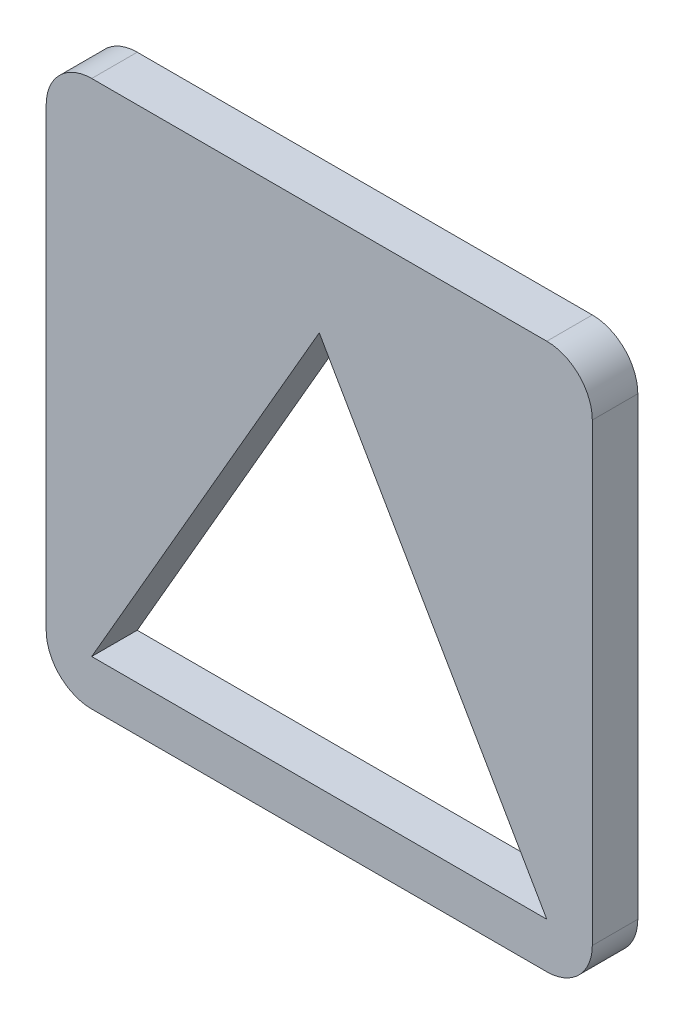
ISO-10303-21;
HEADER;
FILE_DESCRIPTION(('STEP AP214'),'2;1');
FILE_NAME('part.step','',(''),(''),'','','');
FILE_SCHEMA(('AUTOMOTIVE_DESIGN { 1 0 10303 214 1 1 1 1 }'));
ENDSEC;
DATA;
#1=APPLICATION_CONTEXT('core data for automotive mechanical design processes');
#2=APPLICATION_PROTOCOL_DEFINITION('international standard','automotive_design',2000,#1);
#3=PRODUCT_CONTEXT('',#1,'mechanical');
#4=PRODUCT('Part','Part','',(#3));
#5=PRODUCT_RELATED_PRODUCT_CATEGORY('part','',(#4));
#6=PRODUCT_DEFINITION_FORMATION('','',#4);
#7=PRODUCT_DEFINITION_CONTEXT('part definition',#1,'design');
#8=PRODUCT_DEFINITION('design','',#6,#7);
#9=PRODUCT_DEFINITION_SHAPE('','',#8);
#10=(LENGTH_UNIT() NAMED_UNIT(*) SI_UNIT(.MILLI.,.METRE.));
#11=(NAMED_UNIT(*) PLANE_ANGLE_UNIT() SI_UNIT($,.RADIAN.));
#12=(NAMED_UNIT(*) SI_UNIT($,.STERADIAN.) SOLID_ANGLE_UNIT());
#13=UNCERTAINTY_MEASURE_WITH_UNIT(LENGTH_MEASURE(1.E-05),#10,'distance_accuracy_value','');
#14=(GEOMETRIC_REPRESENTATION_CONTEXT(3) GLOBAL_UNCERTAINTY_ASSIGNED_CONTEXT((#13)) GLOBAL_UNIT_ASSIGNED_CONTEXT((#10,
#11,#12)) REPRESENTATION_CONTEXT('',''));
#15=CARTESIAN_POINT('',(0.,0.,0.));
#16=DIRECTION('',(0.,0.,1.));
#17=DIRECTION('',(1.,0.,0.));
#18=AXIS2_PLACEMENT_3D('',#15,#16,#17);
#19=CARTESIAN_POINT('',(-49.9999999999999,60.,10.));
#20=DIRECTION('',(0.,1.,0.));
#21=DIRECTION('',(0.,0.,1.));
#22=AXIS2_PLACEMENT_3D('',#19,#20,#21);
#23=PLANE('',#22);
#24=DIRECTION('',(1.,0.,0.));
#25=VECTOR('',#24,1.);
#26=CARTESIAN_POINT('',(-49.9999999999999,60.,0.));
#27=LINE('',#26,#25);
#28=CARTESIAN_POINT('',(-49.9999999999999,60.,0.));
#29=VERTEX_POINT('',#28);
#30=CARTESIAN_POINT('',(49.9999999999999,60.,0.));
#31=VERTEX_POINT('',#30);
#32=EDGE_CURVE('E142',#29,#31,#27,.T.);
#33=ORIENTED_EDGE('',*,*,#32,.F.);
#34=DIRECTION('',(0.,0.,-1.));
#35=VECTOR('',#34,1.);
#36=CARTESIAN_POINT('',(-49.9999999999999,60.,10.));
#37=LINE('',#36,#35);
#38=CARTESIAN_POINT('',(-49.9999999999999,60.,10.));
#39=VERTEX_POINT('',#38);
#40=EDGE_CURVE('E11',#39,#29,#37,.T.);
#41=ORIENTED_EDGE('',*,*,#40,.F.);
#42=DIRECTION('',(1.,0.,0.));
#43=VECTOR('',#42,1.);
#44=CARTESIAN_POINT('',(-49.9999999999999,60.,10.));
#45=LINE('',#44,#43);
#46=CARTESIAN_POINT('',(49.9999999999999,60.,10.));
#47=VERTEX_POINT('',#46);
#48=EDGE_CURVE('E144',#39,#47,#45,.T.);
#49=ORIENTED_EDGE('',*,*,#48,.T.);
#50=DIRECTION('',(0.,0.,-1.));
#51=VECTOR('',#50,1.);
#52=CARTESIAN_POINT('',(49.9999999999999,60.,10.));
#53=LINE('',#52,#51);
#54=EDGE_CURVE('E36',#47,#31,#53,.T.);
#55=ORIENTED_EDGE('',*,*,#54,.T.);
#56=EDGE_LOOP('',(#33,#41,#49,#55));
#57=FACE_BOUND('',#56,.T.);
#58=ADVANCED_FACE('F33',(#57),#23,.T.);
#59=CARTESIAN_POINT('',(-50.,50.,10.));
#60=DIRECTION('',(0.,0.,-1.));
#61=DIRECTION('',(-1.,0.,0.));
#62=AXIS2_PLACEMENT_3D('',#59,#60,#61);
#63=CYLINDRICAL_SURFACE('',#62,10.);
#64=CARTESIAN_POINT('',(-50.,50.,0.));
#65=DIRECTION('',(0.,0.,1.));
#66=DIRECTION('',(1.,0.,0.));
#67=AXIS2_PLACEMENT_3D('',#64,#65,#66);
#68=CIRCLE('',#67,10.);
#69=CARTESIAN_POINT('',(-60.,49.9999999999999,0.));
#70=VERTEX_POINT('',#69);
#71=EDGE_CURVE('E148',#29,#70,#68,.T.);
#72=ORIENTED_EDGE('',*,*,#71,.T.);
#73=DIRECTION('',(0.,0.,-1.));
#74=VECTOR('',#73,1.);
#75=CARTESIAN_POINT('',(-60.,49.9999999999999,10.));
#76=LINE('',#75,#74);
#77=CARTESIAN_POINT('',(-60.,49.9999999999999,10.));
#78=VERTEX_POINT('',#77);
#79=EDGE_CURVE('E41',#78,#70,#76,.T.);
#80=ORIENTED_EDGE('',*,*,#79,.F.);
#81=CARTESIAN_POINT('',(-50.,50.,10.));
#82=DIRECTION('',(0.,0.,1.));
#83=DIRECTION('',(1.,0.,0.));
#84=AXIS2_PLACEMENT_3D('',#81,#82,#83);
#85=CIRCLE('',#84,10.);
#86=EDGE_CURVE('E162',#39,#78,#85,.T.);
#87=ORIENTED_EDGE('',*,*,#86,.F.);
#88=ORIENTED_EDGE('',*,*,#40,.T.);
#89=EDGE_LOOP('',(#72,#80,#87,#88));
#90=FACE_BOUND('',#89,.T.);
#91=ADVANCED_FACE('F208',(#90),#63,.T.);
#92=CARTESIAN_POINT('',(-60.,49.9999999999999,10.));
#93=DIRECTION('',(1.,0.,0.));
#94=DIRECTION('',(0.,1.,0.));
#95=AXIS2_PLACEMENT_3D('',#92,#93,#94);
#96=PLANE('',#95);
#97=DIRECTION('',(0.,-1.,0.));
#98=VECTOR('',#97,1.);
#99=CARTESIAN_POINT('',(-60.,49.9999999999999,0.));
#100=LINE('',#99,#98);
#101=CARTESIAN_POINT('',(-60.,-49.9999999999999,0.));
#102=VERTEX_POINT('',#101);
#103=EDGE_CURVE('E179',#70,#102,#100,.T.);
#104=ORIENTED_EDGE('',*,*,#103,.T.);
#105=DIRECTION('',(0.,0.,-1.));
#106=VECTOR('',#105,1.);
#107=CARTESIAN_POINT('',(-60.,-49.9999999999999,10.));
#108=LINE('',#107,#106);
#109=CARTESIAN_POINT('',(-60.,-49.9999999999999,10.));
#110=VERTEX_POINT('',#109);
#111=EDGE_CURVE('E184',#110,#102,#108,.T.);
#112=ORIENTED_EDGE('',*,*,#111,.F.);
#113=DIRECTION('',(0.,-1.,0.));
#114=VECTOR('',#113,1.);
#115=CARTESIAN_POINT('',(-60.,49.9999999999999,10.));
#116=LINE('',#115,#114);
#117=EDGE_CURVE('E160',#78,#110,#116,.T.);
#118=ORIENTED_EDGE('',*,*,#117,.F.);
#119=ORIENTED_EDGE('',*,*,#79,.T.);
#120=EDGE_LOOP('',(#104,#112,#118,#119));
#121=FACE_BOUND('',#120,.T.);
#122=ADVANCED_FACE('F212',(#121),#96,.F.);
#123=CARTESIAN_POINT('',(-50.,-50.,10.));
#124=DIRECTION('',(0.,0.,-1.));
#125=DIRECTION('',(-1.,0.,0.));
#126=AXIS2_PLACEMENT_3D('',#123,#124,#125);
#127=CYLINDRICAL_SURFACE('',#126,10.);
#128=CARTESIAN_POINT('',(-50.,-50.,0.));
#129=DIRECTION('',(0.,0.,1.));
#130=DIRECTION('',(1.,0.,0.));
#131=AXIS2_PLACEMENT_3D('',#128,#129,#130);
#132=CIRCLE('',#131,10.);
#133=CARTESIAN_POINT('',(-49.9999999999999,-60.,0.));
#134=VERTEX_POINT('',#133);
#135=EDGE_CURVE('E177',#102,#134,#132,.T.);
#136=ORIENTED_EDGE('',*,*,#135,.T.);
#137=DIRECTION('',(0.,0.,-1.));
#138=VECTOR('',#137,1.);
#139=CARTESIAN_POINT('',(-49.9999999999999,-60.,10.));
#140=LINE('',#139,#138);
#141=CARTESIAN_POINT('',(-49.9999999999999,-60.,10.));
#142=VERTEX_POINT('',#141);
#143=EDGE_CURVE('E187',#142,#134,#140,.T.);
#144=ORIENTED_EDGE('',*,*,#143,.F.);
#145=CARTESIAN_POINT('',(-50.,-50.,10.));
#146=DIRECTION('',(0.,0.,1.));
#147=DIRECTION('',(1.,0.,0.));
#148=AXIS2_PLACEMENT_3D('',#145,#146,#147);
#149=CIRCLE('',#148,10.);
#150=EDGE_CURVE('E158',#110,#142,#149,.T.);
#151=ORIENTED_EDGE('',*,*,#150,.F.);
#152=ORIENTED_EDGE('',*,*,#111,.T.);
#153=EDGE_LOOP('',(#136,#144,#151,#152));
#154=FACE_BOUND('',#153,.T.);
#155=ADVANCED_FACE('F232',(#154),#127,.T.);
#156=CARTESIAN_POINT('',(-49.9999999999999,-60.,10.));
#157=DIRECTION('',(0.,1.,0.));
#158=DIRECTION('',(0.,0.,1.));
#159=AXIS2_PLACEMENT_3D('',#156,#157,#158);
#160=PLANE('',#159);
#161=DIRECTION('',(1.,0.,0.));
#162=VECTOR('',#161,1.);
#163=CARTESIAN_POINT('',(-49.9999999999999,-60.,0.));
#164=LINE('',#163,#162);
#165=CARTESIAN_POINT('',(49.9999999999999,-60.,0.));
#166=VERTEX_POINT('',#165);
#167=EDGE_CURVE('E175',#134,#166,#164,.T.);
#168=ORIENTED_EDGE('',*,*,#167,.T.);
#169=DIRECTION('',(0.,0.,-1.));
#170=VECTOR('',#169,1.);
#171=CARTESIAN_POINT('',(49.9999999999999,-60.,10.));
#172=LINE('',#171,#170);
#173=CARTESIAN_POINT('',(49.9999999999999,-60.,10.));
#174=VERTEX_POINT('',#173);
#175=EDGE_CURVE('E190',#174,#166,#172,.T.);
#176=ORIENTED_EDGE('',*,*,#175,.F.);
#177=DIRECTION('',(1.,0.,0.));
#178=VECTOR('',#177,1.);
#179=CARTESIAN_POINT('',(-49.9999999999999,-60.,10.));
#180=LINE('',#179,#178);
#181=EDGE_CURVE('E156',#142,#174,#180,.T.);
#182=ORIENTED_EDGE('',*,*,#181,.F.);
#183=ORIENTED_EDGE('',*,*,#143,.T.);
#184=EDGE_LOOP('',(#168,#176,#182,#183));
#185=FACE_BOUND('',#184,.T.);
#186=ADVANCED_FACE('F230',(#185),#160,.F.);
#187=CARTESIAN_POINT('',(50.,-50.,10.));
#188=DIRECTION('',(0.,0.,-1.));
#189=DIRECTION('',(-1.,0.,0.));
#190=AXIS2_PLACEMENT_3D('',#187,#188,#189);
#191=CYLINDRICAL_SURFACE('',#190,10.);
#192=CARTESIAN_POINT('',(50.,-50.,0.));
#193=DIRECTION('',(0.,0.,1.));
#194=DIRECTION('',(1.,0.,0.));
#195=AXIS2_PLACEMENT_3D('',#192,#193,#194);
#196=CIRCLE('',#195,10.);
#197=CARTESIAN_POINT('',(60.,-50.,0.));
#198=VERTEX_POINT('',#197);
#199=EDGE_CURVE('E172',#166,#198,#196,.T.);
#200=ORIENTED_EDGE('',*,*,#199,.T.);
#201=DIRECTION('',(0.,0.,-1.));
#202=VECTOR('',#201,1.);
#203=CARTESIAN_POINT('',(60.,-50.,10.));
#204=LINE('',#203,#202);
#205=CARTESIAN_POINT('',(60.,-50.,10.));
#206=VERTEX_POINT('',#205);
#207=EDGE_CURVE('E193',#206,#198,#204,.T.);
#208=ORIENTED_EDGE('',*,*,#207,.F.);
#209=CARTESIAN_POINT('',(50.,-50.,10.));
#210=DIRECTION('',(0.,0.,1.));
#211=DIRECTION('',(1.,0.,0.));
#212=AXIS2_PLACEMENT_3D('',#209,#210,#211);
#213=CIRCLE('',#212,10.);
#214=EDGE_CURVE('E154',#174,#206,#213,.T.);
#215=ORIENTED_EDGE('',*,*,#214,.F.);
#216=ORIENTED_EDGE('',*,*,#175,.T.);
#217=EDGE_LOOP('',(#200,#208,#215,#216));
#218=FACE_BOUND('',#217,.T.);
#219=ADVANCED_FACE('F226',(#218),#191,.T.);
#220=CARTESIAN_POINT('',(60.,49.9999999999999,10.));
#221=DIRECTION('',(1.,0.,0.));
#222=DIRECTION('',(0.,1.,0.));
#223=AXIS2_PLACEMENT_3D('',#220,#221,#222);
#224=PLANE('',#223);
#225=DIRECTION('',(0.,-1.,0.));
#226=VECTOR('',#225,1.);
#227=CARTESIAN_POINT('',(60.,49.9999999999999,0.));
#228=LINE('',#227,#226);
#229=CARTESIAN_POINT('',(60.,49.9999999999999,0.));
#230=VERTEX_POINT('',#229);
#231=EDGE_CURVE('E169',#230,#198,#228,.T.);
#232=ORIENTED_EDGE('',*,*,#231,.F.);
#233=DIRECTION('',(0.,0.,-1.));
#234=VECTOR('',#233,1.);
#235=CARTESIAN_POINT('',(60.,49.9999999999999,10.));
#236=LINE('',#235,#234);
#237=CARTESIAN_POINT('',(60.,49.9999999999999,10.));
#238=VERTEX_POINT('',#237);
#239=EDGE_CURVE('E194',#238,#230,#236,.T.);
#240=ORIENTED_EDGE('',*,*,#239,.F.);
#241=DIRECTION('',(0.,-1.,0.));
#242=VECTOR('',#241,1.);
#243=CARTESIAN_POINT('',(60.,49.9999999999999,10.));
#244=LINE('',#243,#242);
#245=EDGE_CURVE('E151',#238,#206,#244,.T.);
#246=ORIENTED_EDGE('',*,*,#245,.T.);
#247=ORIENTED_EDGE('',*,*,#207,.T.);
#248=EDGE_LOOP('',(#232,#240,#246,#247));
#249=FACE_BOUND('',#248,.T.);
#250=ADVANCED_FACE('F222',(#249),#224,.T.);
#251=CARTESIAN_POINT('',(50.,50.,10.));
#252=DIRECTION('',(0.,0.,-1.));
#253=DIRECTION('',(-1.,0.,0.));
#254=AXIS2_PLACEMENT_3D('',#251,#252,#253);
#255=CYLINDRICAL_SURFACE('',#254,10.);
#256=CARTESIAN_POINT('',(50.,50.,0.));
#257=DIRECTION('',(0.,0.,-1.));
#258=DIRECTION('',(-1.,0.,0.));
#259=AXIS2_PLACEMENT_3D('',#256,#257,#258);
#260=CIRCLE('',#259,10.);
#261=EDGE_CURVE('E166',#31,#230,#260,.T.);
#262=ORIENTED_EDGE('',*,*,#261,.F.);
#263=ORIENTED_EDGE('',*,*,#54,.F.);
#264=CARTESIAN_POINT('',(50.,50.,10.));
#265=DIRECTION('',(0.,0.,-1.));
#266=DIRECTION('',(-1.,0.,0.));
#267=AXIS2_PLACEMENT_3D('',#264,#265,#266);
#268=CIRCLE('',#267,10.);
#269=EDGE_CURVE('E147',#47,#238,#268,.T.);
#270=ORIENTED_EDGE('',*,*,#269,.T.);
#271=ORIENTED_EDGE('',*,*,#239,.T.);
#272=EDGE_LOOP('',(#262,#263,#270,#271));
#273=FACE_BOUND('',#272,.T.);
#274=ADVANCED_FACE('F202',(#273),#255,.T.);
#275=CARTESIAN_POINT('',(50.,50.,10.));
#276=DIRECTION('',(0.,0.,-1.));
#277=DIRECTION('',(-1.,0.,0.));
#278=AXIS2_PLACEMENT_3D('',#275,#276,#277);
#279=PLANE('',#278);
#280=DIRECTION('',(1.,0.,0.));
#281=VECTOR('',#280,1.);
#282=CARTESIAN_POINT('',(-50.,-50.,10.));
#283=LINE('',#282,#281);
#284=CARTESIAN_POINT('',(-50.,-50.,10.));
#285=VERTEX_POINT('',#284);
#286=CARTESIAN_POINT('',(50.,-50.,10.));
#287=VERTEX_POINT('',#286);
#288=EDGE_CURVE('E134',#285,#287,#283,.T.);
#289=ORIENTED_EDGE('',*,*,#288,.F.);
#290=DIRECTION('',(-0.5,-0.866025403784439,0.));
#291=VECTOR('',#290,1.);
#292=CARTESIAN_POINT('',(0.,36.6025403784439,10.));
#293=LINE('',#292,#291);
#294=CARTESIAN_POINT('',(0.,36.6025403784439,10.));
#295=VERTEX_POINT('',#294);
#296=EDGE_CURVE('E49',#295,#285,#293,.T.);
#297=ORIENTED_EDGE('',*,*,#296,.F.);
#298=DIRECTION('',(-0.5,0.866025403784439,0.));
#299=VECTOR('',#298,1.);
#300=CARTESIAN_POINT('',(50.,-50.,10.));
#301=LINE('',#300,#299);
#302=EDGE_CURVE('E131',#287,#295,#301,.T.);
#303=ORIENTED_EDGE('',*,*,#302,.F.);
#304=EDGE_LOOP('',(#289,#297,#303));
#305=FACE_BOUND('',#304,.T.);
#306=ORIENTED_EDGE('',*,*,#48,.F.);
#307=ORIENTED_EDGE('',*,*,#86,.T.);
#308=ORIENTED_EDGE('',*,*,#117,.T.);
#309=ORIENTED_EDGE('',*,*,#150,.T.);
#310=ORIENTED_EDGE('',*,*,#181,.T.);
#311=ORIENTED_EDGE('',*,*,#214,.T.);
#312=ORIENTED_EDGE('',*,*,#245,.F.);
#313=ORIENTED_EDGE('',*,*,#269,.F.);
#314=EDGE_LOOP('',(#306,#307,#308,#309,#310,#311,#312,#313));
#315=FACE_BOUND('',#314,.T.);
#316=ADVANCED_FACE('F216',(#305,#315),#279,.F.);
#317=CARTESIAN_POINT('',(50.,50.,0.));
#318=DIRECTION('',(0.,0.,-1.));
#319=DIRECTION('',(-1.,0.,0.));
#320=AXIS2_PLACEMENT_3D('',#317,#318,#319);
#321=PLANE('',#320);
#322=DIRECTION('',(-0.5,-0.866025403784439,0.));
#323=VECTOR('',#322,1.);
#324=CARTESIAN_POINT('',(0.,36.6025403784439,0.));
#325=LINE('',#324,#323);
#326=CARTESIAN_POINT('',(0.,36.6025403784439,0.));
#327=VERTEX_POINT('',#326);
#328=CARTESIAN_POINT('',(-50.,-50.,0.));
#329=VERTEX_POINT('',#328);
#330=EDGE_CURVE('E118',#327,#329,#325,.T.);
#331=ORIENTED_EDGE('',*,*,#330,.T.);
#332=DIRECTION('',(1.,0.,0.));
#333=VECTOR('',#332,1.);
#334=CARTESIAN_POINT('',(-50.,-50.,0.));
#335=LINE('',#334,#333);
#336=CARTESIAN_POINT('',(50.,-50.,0.));
#337=VERTEX_POINT('',#336);
#338=EDGE_CURVE('E125',#329,#337,#335,.T.);
#339=ORIENTED_EDGE('',*,*,#338,.T.);
#340=DIRECTION('',(-0.5,0.866025403784439,0.));
#341=VECTOR('',#340,1.);
#342=CARTESIAN_POINT('',(50.,-50.,0.));
#343=LINE('',#342,#341);
#344=EDGE_CURVE('E57',#337,#327,#343,.T.);
#345=ORIENTED_EDGE('',*,*,#344,.T.);
#346=EDGE_LOOP('',(#331,#339,#345));
#347=FACE_BOUND('',#346,.T.);
#348=ORIENTED_EDGE('',*,*,#32,.T.);
#349=ORIENTED_EDGE('',*,*,#261,.T.);
#350=ORIENTED_EDGE('',*,*,#231,.T.);
#351=ORIENTED_EDGE('',*,*,#199,.F.);
#352=ORIENTED_EDGE('',*,*,#167,.F.);
#353=ORIENTED_EDGE('',*,*,#135,.F.);
#354=ORIENTED_EDGE('',*,*,#103,.F.);
#355=ORIENTED_EDGE('',*,*,#71,.F.);
#356=EDGE_LOOP('',(#348,#349,#350,#351,#352,#353,#354,#355));
#357=FACE_BOUND('',#356,.T.);
#358=ADVANCED_FACE('F129',(#347,#357),#321,.T.);
#359=CARTESIAN_POINT('',(0.,36.6025403784439,0.));
#360=DIRECTION('',(-0.866025403784439,0.5,0.));
#361=DIRECTION('',(-0.5,-0.866025403784439,0.));
#362=AXIS2_PLACEMENT_3D('',#359,#360,#361);
#363=PLANE('',#362);
#364=ORIENTED_EDGE('',*,*,#296,.T.);
#365=DIRECTION('',(0.,0.,1.));
#366=VECTOR('',#365,1.);
#367=CARTESIAN_POINT('',(-50.,-50.,0.));
#368=LINE('',#367,#366);
#369=EDGE_CURVE('E114',#329,#285,#368,.T.);
#370=ORIENTED_EDGE('',*,*,#369,.F.);
#371=ORIENTED_EDGE('',*,*,#330,.F.);
#372=DIRECTION('',(0.,0.,1.));
#373=VECTOR('',#372,1.);
#374=CARTESIAN_POINT('',(0.,36.6025403784439,0.));
#375=LINE('',#374,#373);
#376=EDGE_CURVE('E140',#327,#295,#375,.T.);
#377=ORIENTED_EDGE('',*,*,#376,.T.);
#378=EDGE_LOOP('',(#364,#370,#371,#377));
#379=FACE_BOUND('',#378,.T.);
#380=ADVANCED_FACE('F116',(#379),#363,.F.);
#381=CARTESIAN_POINT('',(50.,-50.,0.));
#382=DIRECTION('',(0.866025403784439,0.5,0.));
#383=DIRECTION('',(-0.5,0.866025403784439,0.));
#384=AXIS2_PLACEMENT_3D('',#381,#382,#383);
#385=PLANE('',#384);
#386=ORIENTED_EDGE('',*,*,#302,.T.);
#387=ORIENTED_EDGE('',*,*,#376,.F.);
#388=ORIENTED_EDGE('',*,*,#344,.F.);
#389=DIRECTION('',(0.,0.,1.));
#390=VECTOR('',#389,1.);
#391=CARTESIAN_POINT('',(50.,-50.,0.));
#392=LINE('',#391,#390);
#393=EDGE_CURVE('E122',#337,#287,#392,.T.);
#394=ORIENTED_EDGE('',*,*,#393,.T.);
#395=EDGE_LOOP('',(#386,#387,#388,#394));
#396=FACE_BOUND('',#395,.T.);
#397=ADVANCED_FACE('F256',(#396),#385,.F.);
#398=CARTESIAN_POINT('',(-50.,-50.,0.));
#399=DIRECTION('',(0.,-1.,0.));
#400=DIRECTION('',(0.,0.,-1.));
#401=AXIS2_PLACEMENT_3D('',#398,#399,#400);
#402=PLANE('',#401);
#403=ORIENTED_EDGE('',*,*,#288,.T.);
#404=ORIENTED_EDGE('',*,*,#393,.F.);
#405=ORIENTED_EDGE('',*,*,#338,.F.);
#406=ORIENTED_EDGE('',*,*,#369,.T.);
#407=EDGE_LOOP('',(#403,#404,#405,#406));
#408=FACE_BOUND('',#407,.T.);
#409=ADVANCED_FACE('F126',(#408),#402,.F.);
#410=CLOSED_SHELL('',(#58,#91,#122,#155,#186,#219,#250,#274,#316,#358,#380,#397,#409));
#411=MANIFOLD_SOLID_BREP('B2',#410);
#412=ADVANCED_BREP_SHAPE_REPRESENTATION('',(#18,#411),#14);
#413=SHAPE_DEFINITION_REPRESENTATION(#9,#412);
ENDSEC;
END-ISO-10303-21;
